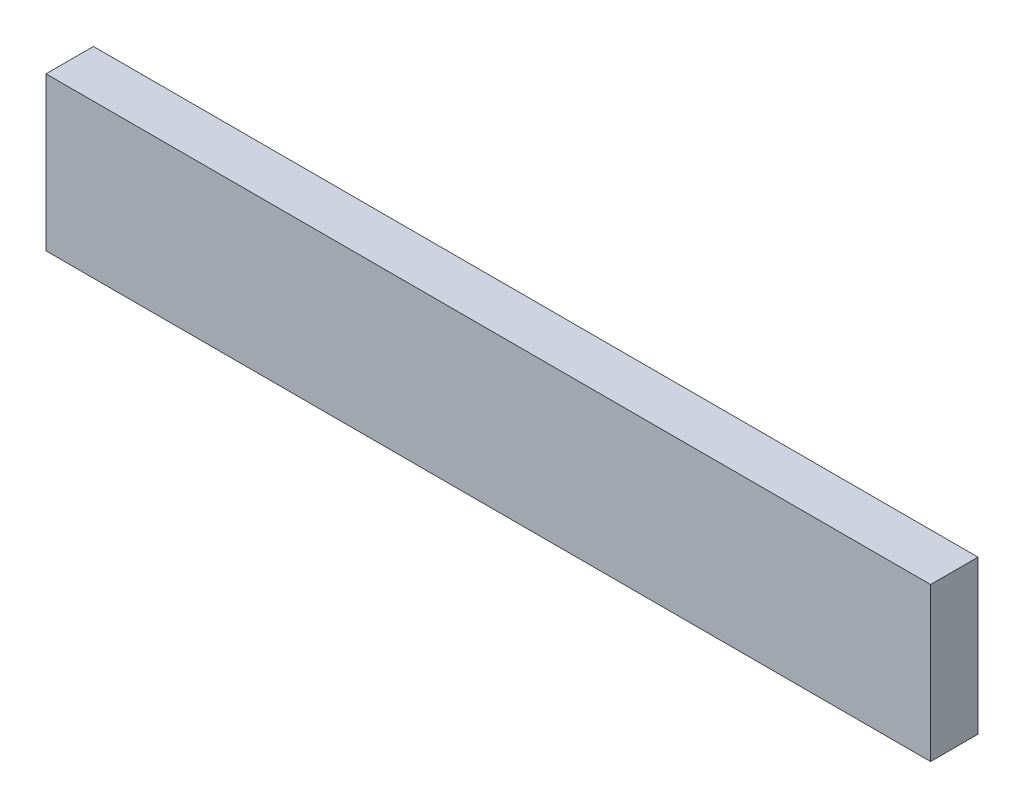
ISO-10303-21;
HEADER;
FILE_DESCRIPTION(('STEP AP214'),'2;1');
FILE_NAME('part.step','',(''),(''),'','','');
FILE_SCHEMA(('AUTOMOTIVE_DESIGN { 1 0 10303 214 1 1 1 1 }'));
ENDSEC;
DATA;
#1=APPLICATION_CONTEXT('core data for automotive mechanical design processes');
#2=APPLICATION_PROTOCOL_DEFINITION('international standard','automotive_design',2000,#1);
#3=PRODUCT_CONTEXT('',#1,'mechanical');
#4=PRODUCT('Part','Part','',(#3));
#5=PRODUCT_RELATED_PRODUCT_CATEGORY('part','',(#4));
#6=PRODUCT_DEFINITION_FORMATION('','',#4);
#7=PRODUCT_DEFINITION_CONTEXT('part definition',#1,'design');
#8=PRODUCT_DEFINITION('design','',#6,#7);
#9=PRODUCT_DEFINITION_SHAPE('','',#8);
#10=(LENGTH_UNIT() NAMED_UNIT(*) SI_UNIT(.MILLI.,.METRE.));
#11=(NAMED_UNIT(*) PLANE_ANGLE_UNIT() SI_UNIT($,.RADIAN.));
#12=(NAMED_UNIT(*) SI_UNIT($,.STERADIAN.) SOLID_ANGLE_UNIT());
#13=UNCERTAINTY_MEASURE_WITH_UNIT(LENGTH_MEASURE(1.E-05),#10,'distance_accuracy_value','');
#14=(GEOMETRIC_REPRESENTATION_CONTEXT(3) GLOBAL_UNCERTAINTY_ASSIGNED_CONTEXT((#13)) GLOBAL_UNIT_ASSIGNED_CONTEXT((#10,
#11,#12)) REPRESENTATION_CONTEXT('',''));
#15=CARTESIAN_POINT('',(0.,0.,0.));
#16=DIRECTION('',(0.,0.,1.));
#17=DIRECTION('',(1.,0.,0.));
#18=AXIS2_PLACEMENT_3D('',#15,#16,#17);
#19=CARTESIAN_POINT('',(27.9798,-4.85,3.));
#20=DIRECTION('',(-1.,0.,0.));
#21=DIRECTION('',(0.,0.,1.));
#22=AXIS2_PLACEMENT_3D('',#19,#20,#21);
#23=PLANE('',#22);
#24=DIRECTION('',(0.,1.,0.));
#25=VECTOR('',#24,1.);
#26=CARTESIAN_POINT('',(27.9798,-4.85,0.));
#27=LINE('',#26,#25);
#28=CARTESIAN_POINT('',(27.9798,-4.85,0.));
#29=VERTEX_POINT('',#28);
#30=CARTESIAN_POINT('',(27.9798,4.85,0.));
#31=VERTEX_POINT('',#30);
#32=EDGE_CURVE('E111',#29,#31,#27,.T.);
#33=ORIENTED_EDGE('',*,*,#32,.T.);
#34=DIRECTION('',(0.,0.,-1.));
#35=VECTOR('',#34,1.);
#36=CARTESIAN_POINT('',(27.9798,4.85,3.));
#37=LINE('',#36,#35);
#38=CARTESIAN_POINT('',(27.9798,4.85,3.));
#39=VERTEX_POINT('',#38);
#40=EDGE_CURVE('E11',#39,#31,#37,.T.);
#41=ORIENTED_EDGE('',*,*,#40,.F.);
#42=DIRECTION('',(0.,1.,0.));
#43=VECTOR('',#42,1.);
#44=CARTESIAN_POINT('',(27.9798,-4.85,3.));
#45=LINE('',#44,#43);
#46=CARTESIAN_POINT('',(27.9798,-4.85,3.));
#47=VERTEX_POINT('',#46);
#48=EDGE_CURVE('E95',#47,#39,#45,.T.);
#49=ORIENTED_EDGE('',*,*,#48,.F.);
#50=DIRECTION('',(0.,0.,-1.));
#51=VECTOR('',#50,1.);
#52=CARTESIAN_POINT('',(27.9798,-4.85,3.));
#53=LINE('',#52,#51);
#54=EDGE_CURVE('E107',#47,#29,#53,.T.);
#55=ORIENTED_EDGE('',*,*,#54,.T.);
#56=EDGE_LOOP('',(#33,#41,#49,#55));
#57=FACE_BOUND('',#56,.T.);
#58=ADVANCED_FACE('F43',(#57),#23,.F.);
#59=CARTESIAN_POINT('',(-27.9798,4.85,3.));
#60=DIRECTION('',(0.,-1.,0.));
#61=DIRECTION('',(0.,0.,-1.));
#62=AXIS2_PLACEMENT_3D('',#59,#60,#61);
#63=PLANE('',#62);
#64=DIRECTION('',(-1.,0.,0.));
#65=VECTOR('',#64,1.);
#66=CARTESIAN_POINT('',(-27.9798,4.85,0.));
#67=LINE('',#66,#65);
#68=CARTESIAN_POINT('',(-27.9798,4.85,0.));
#69=VERTEX_POINT('',#68);
#70=EDGE_CURVE('E100',#31,#69,#67,.T.);
#71=ORIENTED_EDGE('',*,*,#70,.T.);
#72=DIRECTION('',(0.,0.,-1.));
#73=VECTOR('',#72,1.);
#74=CARTESIAN_POINT('',(-27.9798,4.85,3.));
#75=LINE('',#74,#73);
#76=CARTESIAN_POINT('',(-27.9798,4.85,3.));
#77=VERTEX_POINT('',#76);
#78=EDGE_CURVE('E52',#77,#69,#75,.T.);
#79=ORIENTED_EDGE('',*,*,#78,.F.);
#80=DIRECTION('',(-1.,0.,0.));
#81=VECTOR('',#80,1.);
#82=CARTESIAN_POINT('',(-27.9798,4.85,3.));
#83=LINE('',#82,#81);
#84=EDGE_CURVE('E90',#39,#77,#83,.T.);
#85=ORIENTED_EDGE('',*,*,#84,.F.);
#86=ORIENTED_EDGE('',*,*,#40,.T.);
#87=EDGE_LOOP('',(#71,#79,#85,#86));
#88=FACE_BOUND('',#87,.T.);
#89=ADVANCED_FACE('F99',(#88),#63,.F.);
#90=CARTESIAN_POINT('',(-27.9798,-4.85,3.));
#91=DIRECTION('',(1.,0.,0.));
#92=DIRECTION('',(0.,0.,-1.));
#93=AXIS2_PLACEMENT_3D('',#90,#91,#92);
#94=PLANE('',#93);
#95=DIRECTION('',(0.,-1.,0.));
#96=VECTOR('',#95,1.);
#97=CARTESIAN_POINT('',(-27.9798,-4.85,0.));
#98=LINE('',#97,#96);
#99=CARTESIAN_POINT('',(-27.9798,-4.85,0.));
#100=VERTEX_POINT('',#99);
#101=EDGE_CURVE('E77',#69,#100,#98,.T.);
#102=ORIENTED_EDGE('',*,*,#101,.T.);
#103=DIRECTION('',(0.,0.,-1.));
#104=VECTOR('',#103,1.);
#105=CARTESIAN_POINT('',(-27.9798,-4.85,3.));
#106=LINE('',#105,#104);
#107=CARTESIAN_POINT('',(-27.9798,-4.85,3.));
#108=VERTEX_POINT('',#107);
#109=EDGE_CURVE('E102',#108,#100,#106,.T.);
#110=ORIENTED_EDGE('',*,*,#109,.F.);
#111=DIRECTION('',(0.,-1.,0.));
#112=VECTOR('',#111,1.);
#113=CARTESIAN_POINT('',(-27.9798,-4.85,3.));
#114=LINE('',#113,#112);
#115=EDGE_CURVE('E93',#77,#108,#114,.T.);
#116=ORIENTED_EDGE('',*,*,#115,.F.);
#117=ORIENTED_EDGE('',*,*,#78,.T.);
#118=EDGE_LOOP('',(#102,#110,#116,#117));
#119=FACE_BOUND('',#118,.T.);
#120=ADVANCED_FACE('F103',(#119),#94,.F.);
#121=CARTESIAN_POINT('',(-27.9798,-4.85,3.));
#122=DIRECTION('',(0.,1.,0.));
#123=DIRECTION('',(0.,0.,1.));
#124=AXIS2_PLACEMENT_3D('',#121,#122,#123);
#125=PLANE('',#124);
#126=DIRECTION('',(1.,0.,0.));
#127=VECTOR('',#126,1.);
#128=CARTESIAN_POINT('',(-27.9798,-4.85,0.));
#129=LINE('',#128,#127);
#130=EDGE_CURVE('E83',#100,#29,#129,.T.);
#131=ORIENTED_EDGE('',*,*,#130,.T.);
#132=ORIENTED_EDGE('',*,*,#54,.F.);
#133=DIRECTION('',(1.,0.,0.));
#134=VECTOR('',#133,1.);
#135=CARTESIAN_POINT('',(-27.9798,-4.85,3.));
#136=LINE('',#135,#134);
#137=EDGE_CURVE('E60',#108,#47,#136,.T.);
#138=ORIENTED_EDGE('',*,*,#137,.F.);
#139=ORIENTED_EDGE('',*,*,#109,.T.);
#140=EDGE_LOOP('',(#131,#132,#138,#139));
#141=FACE_BOUND('',#140,.T.);
#142=ADVANCED_FACE('F124',(#141),#125,.F.);
#143=CARTESIAN_POINT('',(0.,0.,3.));
#144=DIRECTION('',(0.,0.,-1.));
#145=DIRECTION('',(-1.,0.,0.));
#146=AXIS2_PLACEMENT_3D('',#143,#144,#145);
#147=PLANE('',#146);
#148=ORIENTED_EDGE('',*,*,#48,.T.);
#149=ORIENTED_EDGE('',*,*,#84,.T.);
#150=ORIENTED_EDGE('',*,*,#115,.T.);
#151=ORIENTED_EDGE('',*,*,#137,.T.);
#152=EDGE_LOOP('',(#148,#149,#150,#151));
#153=FACE_BOUND('',#152,.T.);
#154=ADVANCED_FACE('F91',(#153),#147,.F.);
#155=CARTESIAN_POINT('',(0.,0.,0.));
#156=DIRECTION('',(0.,0.,-1.));
#157=DIRECTION('',(-1.,0.,0.));
#158=AXIS2_PLACEMENT_3D('',#155,#156,#157);
#159=PLANE('',#158);
#160=ORIENTED_EDGE('',*,*,#32,.F.);
#161=ORIENTED_EDGE('',*,*,#130,.F.);
#162=ORIENTED_EDGE('',*,*,#101,.F.);
#163=ORIENTED_EDGE('',*,*,#70,.F.);
#164=EDGE_LOOP('',(#160,#161,#162,#163));
#165=FACE_BOUND('',#164,.T.);
#166=ADVANCED_FACE('F127',(#165),#159,.T.);
#167=CLOSED_SHELL('',(#58,#89,#120,#142,#154,#166));
#168=MANIFOLD_SOLID_BREP('B2',#167);
#169=ADVANCED_BREP_SHAPE_REPRESENTATION('',(#18,#168),#14);
#170=SHAPE_DEFINITION_REPRESENTATION(#9,#169);
ENDSEC;
END-ISO-10303-21;
